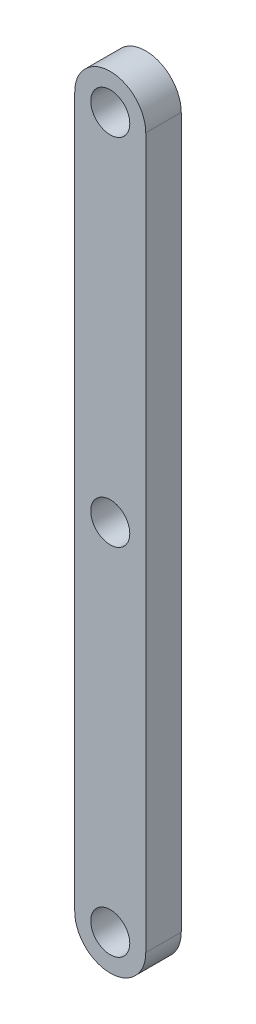
ISO-10303-21;
HEADER;
FILE_DESCRIPTION(('STEP AP214'),'2;1');
FILE_NAME('part.step','',(''),(''),'','','');
FILE_SCHEMA(('AUTOMOTIVE_DESIGN { 1 0 10303 214 1 1 1 1 }'));
ENDSEC;
DATA;
#1=APPLICATION_CONTEXT('core data for automotive mechanical design processes');
#2=APPLICATION_PROTOCOL_DEFINITION('international standard','automotive_design',2000,#1);
#3=PRODUCT_CONTEXT('',#1,'mechanical');
#4=PRODUCT('Part','Part','',(#3));
#5=PRODUCT_RELATED_PRODUCT_CATEGORY('part','',(#4));
#6=PRODUCT_DEFINITION_FORMATION('','',#4);
#7=PRODUCT_DEFINITION_CONTEXT('part definition',#1,'design');
#8=PRODUCT_DEFINITION('design','',#6,#7);
#9=PRODUCT_DEFINITION_SHAPE('','',#8);
#10=(LENGTH_UNIT() NAMED_UNIT(*) SI_UNIT(.MILLI.,.METRE.));
#11=(NAMED_UNIT(*) PLANE_ANGLE_UNIT() SI_UNIT($,.RADIAN.));
#12=(NAMED_UNIT(*) SI_UNIT($,.STERADIAN.) SOLID_ANGLE_UNIT());
#13=UNCERTAINTY_MEASURE_WITH_UNIT(LENGTH_MEASURE(1.E-05),#10,'distance_accuracy_value','');
#14=(GEOMETRIC_REPRESENTATION_CONTEXT(3) GLOBAL_UNCERTAINTY_ASSIGNED_CONTEXT((#13)) GLOBAL_UNIT_ASSIGNED_CONTEXT((#10,
#11,#12)) REPRESENTATION_CONTEXT('',''));
#15=CARTESIAN_POINT('',(0.,0.,0.));
#16=DIRECTION('',(0.,0.,1.));
#17=DIRECTION('',(1.,0.,0.));
#18=AXIS2_PLACEMENT_3D('',#15,#16,#17);
#19=CARTESIAN_POINT('',(2.,0.,2.));
#20=DIRECTION('',(0.,0.,1.));
#21=DIRECTION('',(1.,0.,0.));
#22=AXIS2_PLACEMENT_3D('',#19,#20,#21);
#23=PLANE('',#22);
#24=CARTESIAN_POINT('',(2.,-40.,2.));
#25=DIRECTION('',(0.,0.,1.));
#26=DIRECTION('',(1.,0.,0.));
#27=AXIS2_PLACEMENT_3D('',#24,#25,#26);
#28=CIRCLE('',#27,1.1);
#29=CARTESIAN_POINT('',(3.1,-40.,2.));
#30=VERTEX_POINT('',#29);
#31=EDGE_CURVE('E140',#30,#30,#28,.T.);
#32=ORIENTED_EDGE('',*,*,#31,.F.);
#33=EDGE_LOOP('',(#32));
#34=FACE_BOUND('',#33,.T.);
#35=CARTESIAN_POINT('',(2.,0.,2.));
#36=DIRECTION('',(0.,0.,1.));
#37=DIRECTION('',(1.,0.,0.));
#38=AXIS2_PLACEMENT_3D('',#35,#36,#37);
#39=CIRCLE('',#38,2.);
#40=CARTESIAN_POINT('',(4.,0.,2.));
#41=VERTEX_POINT('',#40);
#42=CARTESIAN_POINT('',(0.,0.,2.));
#43=VERTEX_POINT('',#42);
#44=EDGE_CURVE('E98',#41,#43,#39,.T.);
#45=ORIENTED_EDGE('',*,*,#44,.T.);
#46=DIRECTION('',(0.,-1.,0.));
#47=VECTOR('',#46,1.);
#48=CARTESIAN_POINT('',(0.,0.,2.));
#49=LINE('',#48,#47);
#50=CARTESIAN_POINT('',(0.,-40.,2.));
#51=VERTEX_POINT('',#50);
#52=EDGE_CURVE('E93',#43,#51,#49,.T.);
#53=ORIENTED_EDGE('',*,*,#52,.T.);
#54=CARTESIAN_POINT('',(2.,-40.,2.));
#55=DIRECTION('',(0.,0.,1.));
#56=DIRECTION('',(1.,0.,0.));
#57=AXIS2_PLACEMENT_3D('',#54,#55,#56);
#58=CIRCLE('',#57,2.);
#59=CARTESIAN_POINT('',(4.,-40.,2.));
#60=VERTEX_POINT('',#59);
#61=EDGE_CURVE('E96',#51,#60,#58,.T.);
#62=ORIENTED_EDGE('',*,*,#61,.T.);
#63=DIRECTION('',(0.,1.,0.));
#64=VECTOR('',#63,1.);
#65=CARTESIAN_POINT('',(4.,0.,2.));
#66=LINE('',#65,#64);
#67=EDGE_CURVE('E63',#60,#41,#66,.T.);
#68=ORIENTED_EDGE('',*,*,#67,.T.);
#69=EDGE_LOOP('',(#45,#53,#62,#68));
#70=FACE_BOUND('',#69,.T.);
#71=CARTESIAN_POINT('',(2.,0.,2.));
#72=DIRECTION('',(0.,0.,1.));
#73=DIRECTION('',(1.,0.,0.));
#74=AXIS2_PLACEMENT_3D('',#71,#72,#73);
#75=CIRCLE('',#74,1.1);
#76=CARTESIAN_POINT('',(3.1,0.,2.));
#77=VERTEX_POINT('',#76);
#78=EDGE_CURVE('E118',#77,#77,#75,.T.);
#79=ORIENTED_EDGE('',*,*,#78,.F.);
#80=EDGE_LOOP('',(#79));
#81=FACE_BOUND('',#80,.T.);
#82=CARTESIAN_POINT('',(2.,-20.,2.));
#83=DIRECTION('',(0.,0.,1.));
#84=DIRECTION('',(1.,0.,0.));
#85=AXIS2_PLACEMENT_3D('',#82,#83,#84);
#86=CIRCLE('',#85,1.1);
#87=CARTESIAN_POINT('',(3.1,-20.,2.));
#88=VERTEX_POINT('',#87);
#89=EDGE_CURVE('E148',#88,#88,#86,.T.);
#90=ORIENTED_EDGE('',*,*,#89,.F.);
#91=EDGE_LOOP('',(#90));
#92=FACE_BOUND('',#91,.T.);
#93=ADVANCED_FACE('F45',(#34,#70,#81,#92),#23,.T.);
#94=CARTESIAN_POINT('',(2.,0.,0.));
#95=DIRECTION('',(0.,0.,1.));
#96=DIRECTION('',(1.,0.,0.));
#97=AXIS2_PLACEMENT_3D('',#94,#95,#96);
#98=PLANE('',#97);
#99=CARTESIAN_POINT('',(2.,0.,0.));
#100=DIRECTION('',(0.,0.,1.));
#101=DIRECTION('',(1.,0.,0.));
#102=AXIS2_PLACEMENT_3D('',#99,#100,#101);
#103=CIRCLE('',#102,2.);
#104=CARTESIAN_POINT('',(4.,0.,0.));
#105=VERTEX_POINT('',#104);
#106=CARTESIAN_POINT('',(0.,0.,0.));
#107=VERTEX_POINT('',#106);
#108=EDGE_CURVE('E114',#105,#107,#103,.T.);
#109=ORIENTED_EDGE('',*,*,#108,.F.);
#110=DIRECTION('',(0.,1.,0.));
#111=VECTOR('',#110,1.);
#112=CARTESIAN_POINT('',(4.,0.,0.));
#113=LINE('',#112,#111);
#114=CARTESIAN_POINT('',(4.,-40.,0.));
#115=VERTEX_POINT('',#114);
#116=EDGE_CURVE('E86',#115,#105,#113,.T.);
#117=ORIENTED_EDGE('',*,*,#116,.F.);
#118=CARTESIAN_POINT('',(2.,-40.,0.));
#119=DIRECTION('',(0.,0.,1.));
#120=DIRECTION('',(1.,0.,0.));
#121=AXIS2_PLACEMENT_3D('',#118,#119,#120);
#122=CIRCLE('',#121,2.);
#123=CARTESIAN_POINT('',(0.,-40.,0.));
#124=VERTEX_POINT('',#123);
#125=EDGE_CURVE('E80',#124,#115,#122,.T.);
#126=ORIENTED_EDGE('',*,*,#125,.F.);
#127=DIRECTION('',(0.,-1.,0.));
#128=VECTOR('',#127,1.);
#129=CARTESIAN_POINT('',(0.,0.,0.));
#130=LINE('',#129,#128);
#131=EDGE_CURVE('E103',#107,#124,#130,.T.);
#132=ORIENTED_EDGE('',*,*,#131,.F.);
#133=EDGE_LOOP('',(#109,#117,#126,#132));
#134=FACE_BOUND('',#133,.T.);
#135=CARTESIAN_POINT('',(2.,0.,0.));
#136=DIRECTION('',(0.,0.,1.));
#137=DIRECTION('',(1.,0.,0.));
#138=AXIS2_PLACEMENT_3D('',#135,#136,#137);
#139=CIRCLE('',#138,1.1);
#140=CARTESIAN_POINT('',(3.1,0.,0.));
#141=VERTEX_POINT('',#140);
#142=EDGE_CURVE('E136',#141,#141,#139,.T.);
#143=ORIENTED_EDGE('',*,*,#142,.T.);
#144=EDGE_LOOP('',(#143));
#145=FACE_BOUND('',#144,.T.);
#146=CARTESIAN_POINT('',(2.,-40.,0.));
#147=DIRECTION('',(0.,0.,1.));
#148=DIRECTION('',(1.,0.,0.));
#149=AXIS2_PLACEMENT_3D('',#146,#147,#148);
#150=CIRCLE('',#149,1.1);
#151=CARTESIAN_POINT('',(3.1,-40.,0.));
#152=VERTEX_POINT('',#151);
#153=EDGE_CURVE('E144',#152,#152,#150,.T.);
#154=ORIENTED_EDGE('',*,*,#153,.T.);
#155=EDGE_LOOP('',(#154));
#156=FACE_BOUND('',#155,.T.);
#157=CARTESIAN_POINT('',(2.,-20.,0.));
#158=DIRECTION('',(0.,0.,1.));
#159=DIRECTION('',(1.,0.,0.));
#160=AXIS2_PLACEMENT_3D('',#157,#158,#159);
#161=CIRCLE('',#160,1.1);
#162=CARTESIAN_POINT('',(3.1,-20.,0.));
#163=VERTEX_POINT('',#162);
#164=EDGE_CURVE('E152',#163,#163,#161,.T.);
#165=ORIENTED_EDGE('',*,*,#164,.T.);
#166=EDGE_LOOP('',(#165));
#167=FACE_BOUND('',#166,.T.);
#168=ADVANCED_FACE('F131',(#134,#145,#156,#167),#98,.F.);
#169=CARTESIAN_POINT('',(2.,0.,2.));
#170=DIRECTION('',(0.,0.,-1.));
#171=DIRECTION('',(-1.,0.,0.));
#172=AXIS2_PLACEMENT_3D('',#169,#170,#171);
#173=CYLINDRICAL_SURFACE('',#172,2.);
#174=ORIENTED_EDGE('',*,*,#108,.T.);
#175=DIRECTION('',(0.,0.,-1.));
#176=VECTOR('',#175,1.);
#177=CARTESIAN_POINT('',(0.,0.,2.));
#178=LINE('',#177,#176);
#179=EDGE_CURVE('E11',#43,#107,#178,.T.);
#180=ORIENTED_EDGE('',*,*,#179,.F.);
#181=ORIENTED_EDGE('',*,*,#44,.F.);
#182=DIRECTION('',(0.,0.,-1.));
#183=VECTOR('',#182,1.);
#184=CARTESIAN_POINT('',(4.,0.,2.));
#185=LINE('',#184,#183);
#186=EDGE_CURVE('E110',#41,#105,#185,.T.);
#187=ORIENTED_EDGE('',*,*,#186,.T.);
#188=EDGE_LOOP('',(#174,#180,#181,#187));
#189=FACE_BOUND('',#188,.T.);
#190=ADVANCED_FACE('F47',(#189),#173,.T.);
#191=CARTESIAN_POINT('',(0.,0.,2.));
#192=DIRECTION('',(1.,0.,0.));
#193=DIRECTION('',(0.,1.,0.));
#194=AXIS2_PLACEMENT_3D('',#191,#192,#193);
#195=PLANE('',#194);
#196=ORIENTED_EDGE('',*,*,#131,.T.);
#197=DIRECTION('',(0.,0.,-1.));
#198=VECTOR('',#197,1.);
#199=CARTESIAN_POINT('',(0.,-40.,2.));
#200=LINE('',#199,#198);
#201=EDGE_CURVE('E55',#51,#124,#200,.T.);
#202=ORIENTED_EDGE('',*,*,#201,.F.);
#203=ORIENTED_EDGE('',*,*,#52,.F.);
#204=ORIENTED_EDGE('',*,*,#179,.T.);
#205=EDGE_LOOP('',(#196,#202,#203,#204));
#206=FACE_BOUND('',#205,.T.);
#207=ADVANCED_FACE('F102',(#206),#195,.F.);
#208=CARTESIAN_POINT('',(2.,-40.,2.));
#209=DIRECTION('',(0.,0.,-1.));
#210=DIRECTION('',(-1.,0.,0.));
#211=AXIS2_PLACEMENT_3D('',#208,#209,#210);
#212=CYLINDRICAL_SURFACE('',#211,2.);
#213=ORIENTED_EDGE('',*,*,#125,.T.);
#214=DIRECTION('',(0.,0.,-1.));
#215=VECTOR('',#214,1.);
#216=CARTESIAN_POINT('',(4.,-40.,2.));
#217=LINE('',#216,#215);
#218=EDGE_CURVE('E105',#60,#115,#217,.T.);
#219=ORIENTED_EDGE('',*,*,#218,.F.);
#220=ORIENTED_EDGE('',*,*,#61,.F.);
#221=ORIENTED_EDGE('',*,*,#201,.T.);
#222=EDGE_LOOP('',(#213,#219,#220,#221));
#223=FACE_BOUND('',#222,.T.);
#224=ADVANCED_FACE('F106',(#223),#212,.T.);
#225=CARTESIAN_POINT('',(4.,0.,2.));
#226=DIRECTION('',(-1.,0.,0.));
#227=DIRECTION('',(0.,-1.,0.));
#228=AXIS2_PLACEMENT_3D('',#225,#226,#227);
#229=PLANE('',#228);
#230=ORIENTED_EDGE('',*,*,#116,.T.);
#231=ORIENTED_EDGE('',*,*,#186,.F.);
#232=ORIENTED_EDGE('',*,*,#67,.F.);
#233=ORIENTED_EDGE('',*,*,#218,.T.);
#234=EDGE_LOOP('',(#230,#231,#232,#233));
#235=FACE_BOUND('',#234,.T.);
#236=ADVANCED_FACE('F128',(#235),#229,.F.);
#237=CARTESIAN_POINT('',(2.,0.,2.));
#238=DIRECTION('',(0.,0.,-1.));
#239=DIRECTION('',(-1.,0.,0.));
#240=AXIS2_PLACEMENT_3D('',#237,#238,#239);
#241=CYLINDRICAL_SURFACE('',#240,1.1);
#242=ORIENTED_EDGE('',*,*,#78,.T.);
#243=EDGE_LOOP('',(#242));
#244=FACE_BOUND('',#243,.T.);
#245=ORIENTED_EDGE('',*,*,#142,.F.);
#246=EDGE_LOOP('',(#245));
#247=FACE_BOUND('',#246,.T.);
#248=ADVANCED_FACE('F172',(#244,#247),#241,.F.);
#249=CARTESIAN_POINT('',(2.,-40.,2.));
#250=DIRECTION('',(0.,0.,-1.));
#251=DIRECTION('',(-1.,0.,0.));
#252=AXIS2_PLACEMENT_3D('',#249,#250,#251);
#253=CYLINDRICAL_SURFACE('',#252,1.1);
#254=ORIENTED_EDGE('',*,*,#31,.T.);
#255=EDGE_LOOP('',(#254));
#256=FACE_BOUND('',#255,.T.);
#257=ORIENTED_EDGE('',*,*,#153,.F.);
#258=EDGE_LOOP('',(#257));
#259=FACE_BOUND('',#258,.T.);
#260=ADVANCED_FACE('F217',(#256,#259),#253,.F.);
#261=CARTESIAN_POINT('',(2.,-20.,2.));
#262=DIRECTION('',(0.,0.,-1.));
#263=DIRECTION('',(-1.,0.,0.));
#264=AXIS2_PLACEMENT_3D('',#261,#262,#263);
#265=CYLINDRICAL_SURFACE('',#264,1.1);
#266=ORIENTED_EDGE('',*,*,#89,.T.);
#267=EDGE_LOOP('',(#266));
#268=FACE_BOUND('',#267,.T.);
#269=ORIENTED_EDGE('',*,*,#164,.F.);
#270=EDGE_LOOP('',(#269));
#271=FACE_BOUND('',#270,.T.);
#272=ADVANCED_FACE('F160',(#268,#271),#265,.F.);
#273=CLOSED_SHELL('',(#93,#168,#190,#207,#224,#236,#248,#260,#272));
#274=MANIFOLD_SOLID_BREP('B2',#273);
#275=ADVANCED_BREP_SHAPE_REPRESENTATION('',(#18,#274),#14);
#276=SHAPE_DEFINITION_REPRESENTATION(#9,#275);
ENDSEC;
END-ISO-10303-21;
